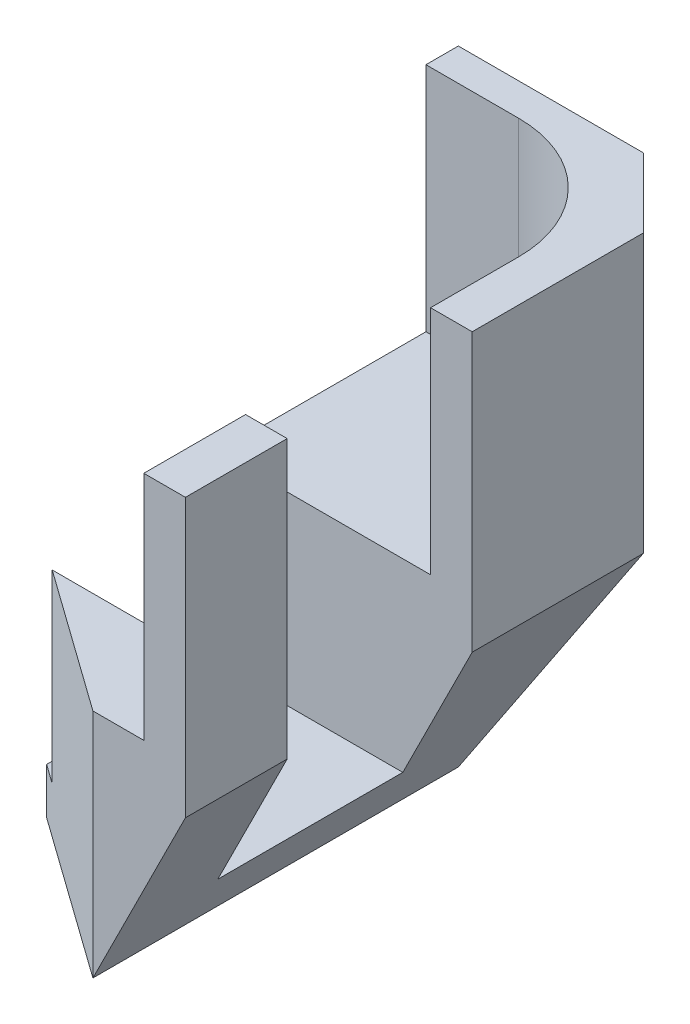
ISO-10303-21;
HEADER;
FILE_DESCRIPTION(('STEP AP214'),'2;1');
FILE_NAME('part.step','',(''),(''),'','','');
FILE_SCHEMA(('AUTOMOTIVE_DESIGN { 1 0 10303 214 1 1 1 1 }'));
ENDSEC;
DATA;
#1=APPLICATION_CONTEXT('core data for automotive mechanical design processes');
#2=APPLICATION_PROTOCOL_DEFINITION('international standard','automotive_design',2000,#1);
#3=PRODUCT_CONTEXT('',#1,'mechanical');
#4=PRODUCT('Part','Part','',(#3));
#5=PRODUCT_RELATED_PRODUCT_CATEGORY('part','',(#4));
#6=PRODUCT_DEFINITION_FORMATION('','',#4);
#7=PRODUCT_DEFINITION_CONTEXT('part definition',#1,'design');
#8=PRODUCT_DEFINITION('design','',#6,#7);
#9=PRODUCT_DEFINITION_SHAPE('','',#8);
#10=(LENGTH_UNIT() NAMED_UNIT(*) SI_UNIT(.MILLI.,.METRE.));
#11=(NAMED_UNIT(*) PLANE_ANGLE_UNIT() SI_UNIT($,.RADIAN.));
#12=(NAMED_UNIT(*) SI_UNIT($,.STERADIAN.) SOLID_ANGLE_UNIT());
#13=UNCERTAINTY_MEASURE_WITH_UNIT(LENGTH_MEASURE(1.E-05),#10,'distance_accuracy_value','');
#14=(GEOMETRIC_REPRESENTATION_CONTEXT(3) GLOBAL_UNCERTAINTY_ASSIGNED_CONTEXT((#13)) GLOBAL_UNIT_ASSIGNED_CONTEXT((#10,
#11,#12)) REPRESENTATION_CONTEXT('',''));
#15=CARTESIAN_POINT('',(0.,0.,0.));
#16=DIRECTION('',(0.,0.,1.));
#17=DIRECTION('',(1.,0.,0.));
#18=AXIS2_PLACEMENT_3D('',#15,#16,#17);
#19=CARTESIAN_POINT('',(0.,0.,0.));
#20=DIRECTION('',(0.,1.,0.));
#21=DIRECTION('',(0.,0.,1.));
#22=AXIS2_PLACEMENT_3D('',#19,#20,#21);
#23=PLANE('',#22);
#24=CARTESIAN_POINT('',(40.,0.,0.));
#25=DIRECTION('',(0.,-1.,0.));
#26=DIRECTION('',(0.,0.,1.));
#27=AXIS2_PLACEMENT_3D('',#24,#25,#26);
#28=CIRCLE('',#27,2.);
#29=CARTESIAN_POINT('',(40.,0.,2.));
#30=VERTEX_POINT('',#29);
#31=EDGE_CURVE('E238',#30,#30,#28,.T.);
#32=ORIENTED_EDGE('',*,*,#31,.F.);
#33=EDGE_LOOP('',(#32));
#34=FACE_BOUND('',#33,.T.);
#35=DIRECTION('',(0.,0.,1.));
#36=VECTOR('',#35,1.);
#37=CARTESIAN_POINT('',(20.,0.,0.));
#38=LINE('',#37,#36);
#39=CARTESIAN_POINT('',(20.,0.,-52.));
#40=VERTEX_POINT('',#39);
#41=CARTESIAN_POINT('',(20.,0.,17.));
#42=VERTEX_POINT('',#41);
#43=EDGE_CURVE('E176',#40,#42,#38,.T.);
#44=ORIENTED_EDGE('',*,*,#43,.F.);
#45=DIRECTION('',(1.,0.,0.));
#46=VECTOR('',#45,1.);
#47=CARTESIAN_POINT('',(-35.,0.,-52.));
#48=LINE('',#47,#46);
#49=CARTESIAN_POINT('',(40.0000700401635,0.,-52.));
#50=VERTEX_POINT('',#49);
#51=EDGE_CURVE('E51',#40,#50,#48,.T.);
#52=ORIENTED_EDGE('',*,*,#51,.T.);
#53=DIRECTION('',(0.707106781186547,0.,0.707106781186547));
#54=VECTOR('',#53,1.);
#55=CARTESIAN_POINT('',(55.,0.,-37.0000700401634));
#56=LINE('',#55,#54);
#57=CARTESIAN_POINT('',(55.,0.,-37.0000700401635));
#58=VERTEX_POINT('',#57);
#59=EDGE_CURVE('E11',#50,#58,#56,.T.);
#60=ORIENTED_EDGE('',*,*,#59,.T.);
#61=DIRECTION('',(0.,0.,-1.));
#62=VECTOR('',#61,1.);
#63=CARTESIAN_POINT('',(55.,0.,42.));
#64=LINE('',#63,#62);
#65=CARTESIAN_POINT('',(55.,0.,42.));
#66=VERTEX_POINT('',#65);
#67=EDGE_CURVE('E289',#66,#58,#64,.T.);
#68=ORIENTED_EDGE('',*,*,#67,.F.);
#69=DIRECTION('',(-0.813733471206735,0.,-0.581238193719096));
#70=VECTOR('',#69,1.);
#71=CARTESIAN_POINT('',(55.,0.,42.));
#72=LINE('',#71,#70);
#73=EDGE_CURVE('E241',#66,#42,#72,.T.);
#74=ORIENTED_EDGE('',*,*,#73,.T.);
#75=EDGE_LOOP('',(#44,#52,#60,#68,#74));
#76=FACE_BOUND('',#75,.T.);
#77=ADVANCED_FACE('F36',(#34,#76),#23,.F.);
#78=CARTESIAN_POINT('',(20.,50.,-72.));
#79=DIRECTION('',(0.,0.,1.));
#80=DIRECTION('',(1.,0.,0.));
#81=AXIS2_PLACEMENT_3D('',#78,#79,#80);
#82=PLANE('',#81);
#83=DIRECTION('',(0.,-1.,0.));
#84=VECTOR('',#83,1.);
#85=CARTESIAN_POINT('',(20.,50.,-72.));
#86=LINE('',#85,#84);
#87=CARTESIAN_POINT('',(20.,100.,-72.));
#88=VERTEX_POINT('',#87);
#89=CARTESIAN_POINT('',(20.,40.,-72.));
#90=VERTEX_POINT('',#89);
#91=EDGE_CURVE('E351',#88,#90,#86,.T.);
#92=ORIENTED_EDGE('',*,*,#91,.F.);
#93=DIRECTION('',(-1.,0.,0.));
#94=VECTOR('',#93,1.);
#95=CARTESIAN_POINT('',(-20.,100.,-72.));
#96=LINE('',#95,#94);
#97=CARTESIAN_POINT('',(60.,100.,-72.));
#98=VERTEX_POINT('',#97);
#99=EDGE_CURVE('E182',#98,#88,#96,.T.);
#100=ORIENTED_EDGE('',*,*,#99,.F.);
#101=DIRECTION('',(0.,-1.,0.));
#102=VECTOR('',#101,1.);
#103=CARTESIAN_POINT('',(60.,0.,-72.));
#104=LINE('',#103,#102);
#105=CARTESIAN_POINT('',(60.,40.,-72.));
#106=VERTEX_POINT('',#105);
#107=EDGE_CURVE('E181',#98,#106,#104,.T.);
#108=ORIENTED_EDGE('',*,*,#107,.T.);
#109=DIRECTION('',(1.,0.,0.));
#110=VECTOR('',#109,1.);
#111=CARTESIAN_POINT('',(-35.,40.,-72.));
#112=LINE('',#111,#110);
#113=EDGE_CURVE('E253',#90,#106,#112,.T.);
#114=ORIENTED_EDGE('',*,*,#113,.F.);
#115=EDGE_LOOP('',(#92,#100,#108,#114));
#116=FACE_BOUND('',#115,.T.);
#117=ADVANCED_FACE('F371',(#116),#82,.F.);
#118=CARTESIAN_POINT('',(0.,10.,0.));
#119=DIRECTION('',(0.,1.,0.));
#120=DIRECTION('',(0.,0.,1.));
#121=AXIS2_PLACEMENT_3D('',#118,#119,#120);
#122=PLANE('',#121);
#123=CARTESIAN_POINT('',(40.,10.,0.));
#124=DIRECTION('',(0.,1.,0.));
#125=DIRECTION('',(0.,0.,1.));
#126=AXIS2_PLACEMENT_3D('',#123,#124,#125);
#127=CIRCLE('',#126,2.);
#128=CARTESIAN_POINT('',(40.,10.,2.));
#129=VERTEX_POINT('',#128);
#130=EDGE_CURVE('E199',#129,#129,#127,.F.);
#131=ORIENTED_EDGE('',*,*,#130,.T.);
#132=EDGE_LOOP('',(#131));
#133=FACE_BOUND('',#132,.T.);
#134=DIRECTION('',(-1.,0.,0.));
#135=VECTOR('',#134,1.);
#136=CARTESIAN_POINT('',(-35.,10.,-20.));
#137=LINE('',#136,#135);
#138=CARTESIAN_POINT('',(60.,10.,-20.));
#139=VERTEX_POINT('',#138);
#140=CARTESIAN_POINT('',(20.,10.,-20.));
#141=VERTEX_POINT('',#140);
#142=EDGE_CURVE('E193',#139,#141,#137,.T.);
#143=ORIENTED_EDGE('',*,*,#142,.T.);
#144=DIRECTION('',(0.,0.,1.));
#145=VECTOR('',#144,1.);
#146=CARTESIAN_POINT('',(20.,10.,0.));
#147=LINE('',#146,#145);
#148=CARTESIAN_POINT('',(20.,10.,17.));
#149=VERTEX_POINT('',#148);
#150=EDGE_CURVE('E174',#141,#149,#147,.T.);
#151=ORIENTED_EDGE('',*,*,#150,.T.);
#152=DIRECTION('',(-0.813733471206735,0.,-0.581238193719096));
#153=VECTOR('',#152,1.);
#154=CARTESIAN_POINT('',(55.,10.,42.));
#155=LINE('',#154,#153);
#156=CARTESIAN_POINT('',(24.2,10.,20.));
#157=VERTEX_POINT('',#156);
#158=EDGE_CURVE('E189',#157,#149,#155,.T.);
#159=ORIENTED_EDGE('',*,*,#158,.F.);
#160=DIRECTION('',(-1.,0.,0.));
#161=VECTOR('',#160,1.);
#162=CARTESIAN_POINT('',(75.,10.,20.));
#163=LINE('',#162,#161);
#164=CARTESIAN_POINT('',(60.,9.99999999999998,20.));
#165=VERTEX_POINT('',#164);
#166=EDGE_CURVE('E308',#165,#157,#163,.T.);
#167=ORIENTED_EDGE('',*,*,#166,.F.);
#168=DIRECTION('',(0.,0.,-1.));
#169=VECTOR('',#168,1.);
#170=CARTESIAN_POINT('',(60.,10.,0.));
#171=LINE('',#170,#169);
#172=EDGE_CURVE('E301',#165,#139,#171,.T.);
#173=ORIENTED_EDGE('',*,*,#172,.T.);
#174=EDGE_LOOP('',(#143,#151,#159,#167,#173));
#175=FACE_BOUND('',#174,.T.);
#176=ADVANCED_FACE('F187',(#133,#175),#122,.T.);
#177=CARTESIAN_POINT('',(-35.,100.,-20.));
#178=DIRECTION('',(0.,0.,1.));
#179=DIRECTION('',(1.,0.,0.));
#180=AXIS2_PLACEMENT_3D('',#177,#178,#179);
#181=PLANE('',#180);
#182=DIRECTION('',(1.,0.,0.));
#183=VECTOR('',#182,1.);
#184=CARTESIAN_POINT('',(0.,50.,-20.));
#185=LINE('',#184,#183);
#186=CARTESIAN_POINT('',(20.,50.,-20.));
#187=VERTEX_POINT('',#186);
#188=CARTESIAN_POINT('',(66.,50.,-20.));
#189=VERTEX_POINT('',#188);
#190=EDGE_CURVE('E257',#187,#189,#185,.T.);
#191=ORIENTED_EDGE('',*,*,#190,.F.);
#192=DIRECTION('',(0.,-1.,0.));
#193=VECTOR('',#192,1.);
#194=CARTESIAN_POINT('',(20.,100.,-20.));
#195=LINE('',#194,#193);
#196=EDGE_CURVE('E349',#187,#141,#195,.T.);
#197=ORIENTED_EDGE('',*,*,#196,.T.);
#198=ORIENTED_EDGE('',*,*,#142,.F.);
#199=DIRECTION('',(0.447213595499958,0.894427190999916,0.));
#200=VECTOR('',#199,1.);
#201=CARTESIAN_POINT('',(77.,44.,-20.));
#202=LINE('',#201,#200);
#203=CARTESIAN_POINT('',(75.,40.,-20.));
#204=VERTEX_POINT('',#203);
#205=EDGE_CURVE('E303',#139,#204,#202,.T.);
#206=ORIENTED_EDGE('',*,*,#205,.T.);
#207=DIRECTION('',(0.,-1.,0.));
#208=VECTOR('',#207,1.);
#209=CARTESIAN_POINT('',(75.,100.,-20.));
#210=LINE('',#209,#208);
#211=CARTESIAN_POINT('',(75.,100.,-20.));
#212=VERTEX_POINT('',#211);
#213=EDGE_CURVE('E319',#212,#204,#210,.T.);
#214=ORIENTED_EDGE('',*,*,#213,.F.);
#215=DIRECTION('',(1.,0.,0.));
#216=VECTOR('',#215,1.);
#217=CARTESIAN_POINT('',(75.,100.,-20.));
#218=LINE('',#217,#216);
#219=CARTESIAN_POINT('',(66.,100.,-20.));
#220=VERTEX_POINT('',#219);
#221=EDGE_CURVE('E310',#220,#212,#218,.T.);
#222=ORIENTED_EDGE('',*,*,#221,.F.);
#223=DIRECTION('',(0.,-1.,0.));
#224=VECTOR('',#223,1.);
#225=CARTESIAN_POINT('',(66.,100.,-20.));
#226=LINE('',#225,#224);
#227=EDGE_CURVE('E271',#220,#189,#226,.T.);
#228=ORIENTED_EDGE('',*,*,#227,.T.);
#229=EDGE_LOOP('',(#191,#197,#198,#206,#214,#222,#228));
#230=FACE_BOUND('',#229,.T.);
#231=ADVANCED_FACE('F348',(#230),#181,.T.);
#232=CARTESIAN_POINT('',(0.,50.,0.));
#233=DIRECTION('',(0.,1.,0.));
#234=DIRECTION('',(0.,0.,1.));
#235=AXIS2_PLACEMENT_3D('',#232,#233,#234);
#236=PLANE('',#235);
#237=DIRECTION('',(1.,0.,0.));
#238=VECTOR('',#237,1.);
#239=CARTESIAN_POINT('',(20.,50.,-65.));
#240=LINE('',#239,#238);
#241=CARTESIAN_POINT('',(20.,50.,-65.));
#242=VERTEX_POINT('',#241);
#243=CARTESIAN_POINT('',(40.,50.,-65.));
#244=VERTEX_POINT('',#243);
#245=EDGE_CURVE('E259',#242,#244,#240,.T.);
#246=ORIENTED_EDGE('',*,*,#245,.F.);
#247=DIRECTION('',(0.,0.,1.));
#248=VECTOR('',#247,1.);
#249=CARTESIAN_POINT('',(20.,50.,0.));
#250=LINE('',#249,#248);
#251=EDGE_CURVE('E361',#242,#187,#250,.T.);
#252=ORIENTED_EDGE('',*,*,#251,.T.);
#253=ORIENTED_EDGE('',*,*,#190,.T.);
#254=DIRECTION('',(0.,0.,-1.));
#255=VECTOR('',#254,1.);
#256=CARTESIAN_POINT('',(66.,50.,-39.));
#257=LINE('',#256,#255);
#258=CARTESIAN_POINT('',(66.,50.,-39.));
#259=VERTEX_POINT('',#258);
#260=EDGE_CURVE('E202',#189,#259,#257,.T.);
#261=ORIENTED_EDGE('',*,*,#260,.T.);
#262=CARTESIAN_POINT('',(40.,50.,-39.));
#263=DIRECTION('',(0.,1.,0.));
#264=DIRECTION('',(0.,0.,1.));
#265=AXIS2_PLACEMENT_3D('',#262,#263,#264);
#266=CIRCLE('',#265,26.);
#267=EDGE_CURVE('E198',#259,#244,#266,.T.);
#268=ORIENTED_EDGE('',*,*,#267,.T.);
#269=EDGE_LOOP('',(#246,#252,#253,#261,#268));
#270=FACE_BOUND('',#269,.T.);
#271=ADVANCED_FACE('F392',(#270),#236,.T.);
#272=CARTESIAN_POINT('',(0.,100.,-39.));
#273=DIRECTION('',(0.,1.,0.));
#274=DIRECTION('',(0.,0.,1.));
#275=AXIS2_PLACEMENT_3D('',#272,#273,#274);
#276=PLANE('',#275);
#277=ORIENTED_EDGE('',*,*,#99,.T.);
#278=DIRECTION('',(0.,0.,1.));
#279=VECTOR('',#278,1.);
#280=CARTESIAN_POINT('',(20.,100.,-39.));
#281=LINE('',#280,#279);
#282=CARTESIAN_POINT('',(20.,100.,-65.));
#283=VERTEX_POINT('',#282);
#284=EDGE_CURVE('E354',#88,#283,#281,.T.);
#285=ORIENTED_EDGE('',*,*,#284,.T.);
#286=DIRECTION('',(1.,0.,0.));
#287=VECTOR('',#286,1.);
#288=CARTESIAN_POINT('',(20.,100.,-65.));
#289=LINE('',#288,#287);
#290=CARTESIAN_POINT('',(40.,100.,-65.));
#291=VERTEX_POINT('',#290);
#292=EDGE_CURVE('E260',#283,#291,#289,.T.);
#293=ORIENTED_EDGE('',*,*,#292,.T.);
#294=CARTESIAN_POINT('',(40.,100.,-39.));
#295=DIRECTION('',(0.,1.,0.));
#296=DIRECTION('',(0.,0.,1.));
#297=AXIS2_PLACEMENT_3D('',#294,#295,#296);
#298=CIRCLE('',#297,26.);
#299=CARTESIAN_POINT('',(66.,100.,-39.));
#300=VERTEX_POINT('',#299);
#301=EDGE_CURVE('E212',#300,#291,#298,.T.);
#302=ORIENTED_EDGE('',*,*,#301,.F.);
#303=DIRECTION('',(0.,0.,-1.));
#304=VECTOR('',#303,1.);
#305=CARTESIAN_POINT('',(66.,100.,-39.));
#306=LINE('',#305,#304);
#307=EDGE_CURVE('E216',#220,#300,#306,.T.);
#308=ORIENTED_EDGE('',*,*,#307,.F.);
#309=ORIENTED_EDGE('',*,*,#221,.T.);
#310=DIRECTION('',(0.,0.,1.));
#311=VECTOR('',#310,1.);
#312=CARTESIAN_POINT('',(75.,100.,42.));
#313=LINE('',#312,#311);
#314=CARTESIAN_POINT('',(75.,100.,-57.));
#315=VERTEX_POINT('',#314);
#316=EDGE_CURVE('E224',#315,#212,#313,.T.);
#317=ORIENTED_EDGE('',*,*,#316,.F.);
#318=DIRECTION('',(0.707106781186549,0.,0.707106781186546));
#319=VECTOR('',#318,1.);
#320=CARTESIAN_POINT('',(75.,100.,-57.));
#321=LINE('',#320,#319);
#322=EDGE_CURVE('E209',#98,#315,#321,.T.);
#323=ORIENTED_EDGE('',*,*,#322,.F.);
#324=EDGE_LOOP('',(#277,#285,#293,#302,#308,#309,#317,#323));
#325=FACE_BOUND('',#324,.T.);
#326=ADVANCED_FACE('F373',(#325),#276,.T.);
#327=CARTESIAN_POINT('',(20.,100.,-65.));
#328=DIRECTION('',(0.,0.,-1.));
#329=DIRECTION('',(-1.,0.,0.));
#330=AXIS2_PLACEMENT_3D('',#327,#328,#329);
#331=PLANE('',#330);
#332=DIRECTION('',(0.,1.,0.));
#333=VECTOR('',#332,1.);
#334=CARTESIAN_POINT('',(20.,100.,-65.));
#335=LINE('',#334,#333);
#336=EDGE_CURVE('E363',#242,#283,#335,.T.);
#337=ORIENTED_EDGE('',*,*,#336,.F.);
#338=ORIENTED_EDGE('',*,*,#245,.T.);
#339=DIRECTION('',(0.,-1.,0.));
#340=VECTOR('',#339,1.);
#341=CARTESIAN_POINT('',(40.,100.,-65.));
#342=LINE('',#341,#340);
#343=EDGE_CURVE('E235',#291,#244,#342,.T.);
#344=ORIENTED_EDGE('',*,*,#343,.F.);
#345=ORIENTED_EDGE('',*,*,#292,.F.);
#346=EDGE_LOOP('',(#337,#338,#344,#345));
#347=FACE_BOUND('',#346,.T.);
#348=ADVANCED_FACE('F395',(#347),#331,.F.);
#349=CARTESIAN_POINT('',(-35.,40.,-72.));
#350=DIRECTION('',(0.,0.447213595499958,0.894427190999916));
#351=DIRECTION('',(0.,-0.894427190999916,0.447213595499958));
#352=AXIS2_PLACEMENT_3D('',#349,#350,#351);
#353=PLANE('',#352);
#354=DIRECTION('',(0.,-0.894427190999916,0.447213595499958));
#355=VECTOR('',#354,1.);
#356=CARTESIAN_POINT('',(20.,40.,-72.));
#357=LINE('',#356,#355);
#358=EDGE_CURVE('E352',#90,#40,#357,.T.);
#359=ORIENTED_EDGE('',*,*,#358,.F.);
#360=ORIENTED_EDGE('',*,*,#113,.T.);
#361=DIRECTION('',(-0.408248290463864,0.816496580927725,-0.408248290463863));
#362=VECTOR('',#361,1.);
#363=CARTESIAN_POINT('',(56.6666666666667,46.6666666666667,-75.3333333333333));
#364=LINE('',#363,#362);
#365=CARTESIAN_POINT('',(60.0000350200817,39.9999299598365,-71.9999649799183));
#366=VERTEX_POINT('',#365);
#367=EDGE_CURVE('E284',#366,#106,#364,.T.);
#368=ORIENTED_EDGE('',*,*,#367,.F.);
#369=DIRECTION('',(-0.408248290463863,-0.816496580927726,0.408248290463863));
#370=VECTOR('',#369,1.);
#371=CARTESIAN_POINT('',(42.5000583668029,4.99997665327885,-54.4999883266394));
#372=LINE('',#371,#370);
#373=EDGE_CURVE('E45',#366,#50,#372,.T.);
#374=ORIENTED_EDGE('',*,*,#373,.T.);
#375=ORIENTED_EDGE('',*,*,#51,.F.);
#376=EDGE_LOOP('',(#359,#360,#368,#374,#375));
#377=FACE_BOUND('',#376,.T.);
#378=ADVANCED_FACE('F283',(#377),#353,.F.);
#379=CARTESIAN_POINT('',(60.,50.,-72.));
#380=DIRECTION('',(0.707106781186546,0.,-0.707106781186549));
#381=DIRECTION('',(0.,1.,0.));
#382=AXIS2_PLACEMENT_3D('',#379,#380,#381);
#383=PLANE('',#382);
#384=DIRECTION('',(-0.408248290463863,-0.816496580927726,-0.408248290463862));
#385=VECTOR('',#384,1.);
#386=CARTESIAN_POINT('',(73.3333333333334,36.6666666666667,-58.6666666666667));
#387=LINE('',#386,#385);
#388=CARTESIAN_POINT('',(75.,40.,-57.));
#389=VERTEX_POINT('',#388);
#390=CARTESIAN_POINT('',(74.9999649799183,39.9999299598366,-57.0000350200817));
#391=VERTEX_POINT('',#390);
#392=EDGE_CURVE('E306',#389,#391,#387,.T.);
#393=ORIENTED_EDGE('',*,*,#392,.T.);
#394=DIRECTION('',(-0.707106781186549,0.,-0.707106781186546));
#395=VECTOR('',#394,1.);
#396=CARTESIAN_POINT('',(60.,39.9999299598365,-72.));
#397=LINE('',#396,#395);
#398=EDGE_CURVE('E59',#391,#366,#397,.T.);
#399=ORIENTED_EDGE('',*,*,#398,.T.);
#400=ORIENTED_EDGE('',*,*,#367,.T.);
#401=ORIENTED_EDGE('',*,*,#107,.F.);
#402=ORIENTED_EDGE('',*,*,#322,.T.);
#403=DIRECTION('',(0.,1.,0.));
#404=VECTOR('',#403,1.);
#405=CARTESIAN_POINT('',(75.,50.,-57.));
#406=LINE('',#405,#404);
#407=EDGE_CURVE('E267',#389,#315,#406,.T.);
#408=ORIENTED_EDGE('',*,*,#407,.F.);
#409=EDGE_LOOP('',(#393,#399,#400,#401,#402,#408));
#410=FACE_BOUND('',#409,.T.);
#411=ADVANCED_FACE('F366',(#410),#383,.T.);
#412=CARTESIAN_POINT('',(55.,0.,42.));
#413=DIRECTION('',(0.894427190999916,-0.447213595499958,0.));
#414=DIRECTION('',(0.447213595499958,0.894427190999916,0.));
#415=AXIS2_PLACEMENT_3D('',#412,#413,#414);
#416=PLANE('',#415);
#417=ORIENTED_EDGE('',*,*,#67,.T.);
#418=DIRECTION('',(0.408248290463863,0.816496580927726,-0.408248290463863));
#419=VECTOR('',#418,1.);
#420=CARTESIAN_POINT('',(69.9999883266394,29.9999766532789,-52.0000583668029));
#421=LINE('',#420,#419);
#422=EDGE_CURVE('E276',#58,#391,#421,.T.);
#423=ORIENTED_EDGE('',*,*,#422,.T.);
#424=ORIENTED_EDGE('',*,*,#392,.F.);
#425=DIRECTION('',(0.,0.,-1.));
#426=VECTOR('',#425,1.);
#427=CARTESIAN_POINT('',(75.,40.,42.));
#428=LINE('',#427,#426);
#429=EDGE_CURVE('E294',#204,#389,#428,.T.);
#430=ORIENTED_EDGE('',*,*,#429,.F.);
#431=ORIENTED_EDGE('',*,*,#205,.F.);
#432=ORIENTED_EDGE('',*,*,#172,.F.);
#433=DIRECTION('',(0.447213595499958,0.894427190999916,0.));
#434=VECTOR('',#433,1.);
#435=CARTESIAN_POINT('',(99.,88.,20.));
#436=LINE('',#435,#434);
#437=CARTESIAN_POINT('',(75.,40.,20.));
#438=VERTEX_POINT('',#437);
#439=EDGE_CURVE('E273',#165,#438,#436,.T.);
#440=ORIENTED_EDGE('',*,*,#439,.T.);
#441=CARTESIAN_POINT('',(75.,40.,42.));
#442=VERTEX_POINT('',#441);
#443=EDGE_CURVE('E297',#442,#438,#428,.T.);
#444=ORIENTED_EDGE('',*,*,#443,.F.);
#445=DIRECTION('',(-0.447213595499958,-0.894427190999916,0.));
#446=VECTOR('',#445,1.);
#447=CARTESIAN_POINT('',(55.,0.,42.));
#448=LINE('',#447,#446);
#449=EDGE_CURVE('E293',#442,#66,#448,.T.);
#450=ORIENTED_EDGE('',*,*,#449,.T.);
#451=EDGE_LOOP('',(#417,#423,#424,#430,#431,#432,#440,#444,#450));
#452=FACE_BOUND('',#451,.T.);
#453=ADVANCED_FACE('F291',(#452),#416,.T.);
#454=CARTESIAN_POINT('',(75.,50.,42.));
#455=DIRECTION('',(0.,0.,1.));
#456=DIRECTION('',(1.,0.,0.));
#457=AXIS2_PLACEMENT_3D('',#454,#455,#456);
#458=PLANE('',#457);
#459=DIRECTION('',(0.,-1.,0.));
#460=VECTOR('',#459,1.);
#461=CARTESIAN_POINT('',(55.,50.,42.));
#462=LINE('',#461,#460);
#463=CARTESIAN_POINT('',(55.,50.,42.));
#464=VERTEX_POINT('',#463);
#465=EDGE_CURVE('E250',#464,#66,#462,.T.);
#466=ORIENTED_EDGE('',*,*,#465,.T.);
#467=ORIENTED_EDGE('',*,*,#449,.F.);
#468=DIRECTION('',(0.,-1.,0.));
#469=VECTOR('',#468,1.);
#470=CARTESIAN_POINT('',(75.,50.,42.));
#471=LINE('',#470,#469);
#472=CARTESIAN_POINT('',(75.,100.,42.));
#473=VERTEX_POINT('',#472);
#474=EDGE_CURVE('E246',#473,#442,#471,.T.);
#475=ORIENTED_EDGE('',*,*,#474,.F.);
#476=DIRECTION('',(-1.,0.,0.));
#477=VECTOR('',#476,1.);
#478=CARTESIAN_POINT('',(66.,100.,42.));
#479=LINE('',#478,#477);
#480=CARTESIAN_POINT('',(66.,100.,42.));
#481=VERTEX_POINT('',#480);
#482=EDGE_CURVE('E220',#473,#481,#479,.T.);
#483=ORIENTED_EDGE('',*,*,#482,.T.);
#484=DIRECTION('',(0.,-1.,0.));
#485=VECTOR('',#484,1.);
#486=CARTESIAN_POINT('',(66.,100.,42.));
#487=LINE('',#486,#485);
#488=CARTESIAN_POINT('',(66.,50.,42.));
#489=VERTEX_POINT('',#488);
#490=EDGE_CURVE('E226',#481,#489,#487,.T.);
#491=ORIENTED_EDGE('',*,*,#490,.T.);
#492=DIRECTION('',(-1.,0.,0.));
#493=VECTOR('',#492,1.);
#494=CARTESIAN_POINT('',(75.,50.,42.));
#495=LINE('',#494,#493);
#496=EDGE_CURVE('E244',#489,#464,#495,.T.);
#497=ORIENTED_EDGE('',*,*,#496,.T.);
#498=EDGE_LOOP('',(#466,#467,#475,#483,#491,#497));
#499=FACE_BOUND('',#498,.T.);
#500=ADVANCED_FACE('F333',(#499),#458,.T.);
#501=CARTESIAN_POINT('',(75.,50.,-72.));
#502=DIRECTION('',(1.,0.,0.));
#503=DIRECTION('',(0.,0.,-1.));
#504=AXIS2_PLACEMENT_3D('',#501,#502,#503);
#505=PLANE('',#504);
#506=ORIENTED_EDGE('',*,*,#474,.T.);
#507=ORIENTED_EDGE('',*,*,#443,.T.);
#508=DIRECTION('',(0.,-1.,0.));
#509=VECTOR('',#508,1.);
#510=CARTESIAN_POINT('',(75.,100.,20.));
#511=LINE('',#510,#509);
#512=CARTESIAN_POINT('',(75.,100.,20.));
#513=VERTEX_POINT('',#512);
#514=EDGE_CURVE('E316',#513,#438,#511,.T.);
#515=ORIENTED_EDGE('',*,*,#514,.F.);
#516=EDGE_CURVE('E223',#513,#473,#313,.T.);
#517=ORIENTED_EDGE('',*,*,#516,.T.);
#518=EDGE_LOOP('',(#506,#507,#515,#517));
#519=FACE_BOUND('',#518,.T.);
#520=ADVANCED_FACE('F344',(#519),#505,.T.);
#521=ORIENTED_EDGE('',*,*,#213,.T.);
#522=ORIENTED_EDGE('',*,*,#429,.T.);
#523=ORIENTED_EDGE('',*,*,#407,.T.);
#524=ORIENTED_EDGE('',*,*,#316,.T.);
#525=EDGE_LOOP('',(#521,#522,#523,#524));
#526=FACE_BOUND('',#525,.T.);
#527=ADVANCED_FACE('F378',(#526),#505,.T.);
#528=CARTESIAN_POINT('',(75.,100.,20.));
#529=DIRECTION('',(0.,0.,1.));
#530=DIRECTION('',(1.,0.,0.));
#531=AXIS2_PLACEMENT_3D('',#528,#529,#530);
#532=PLANE('',#531);
#533=ORIENTED_EDGE('',*,*,#439,.F.);
#534=ORIENTED_EDGE('',*,*,#166,.T.);
#535=DIRECTION('',(0.,1.,0.));
#536=VECTOR('',#535,1.);
#537=CARTESIAN_POINT('',(24.2,50.,20.));
#538=LINE('',#537,#536);
#539=CARTESIAN_POINT('',(24.2,50.,20.));
#540=VERTEX_POINT('',#539);
#541=EDGE_CURVE('E197',#157,#540,#538,.T.);
#542=ORIENTED_EDGE('',*,*,#541,.T.);
#543=DIRECTION('',(1.,0.,0.));
#544=VECTOR('',#543,1.);
#545=CARTESIAN_POINT('',(0.,50.,20.));
#546=LINE('',#545,#544);
#547=CARTESIAN_POINT('',(66.,50.,20.));
#548=VERTEX_POINT('',#547);
#549=EDGE_CURVE('E321',#540,#548,#546,.T.);
#550=ORIENTED_EDGE('',*,*,#549,.T.);
#551=DIRECTION('',(0.,1.,0.));
#552=VECTOR('',#551,1.);
#553=CARTESIAN_POINT('',(66.,100.,20.));
#554=LINE('',#553,#552);
#555=CARTESIAN_POINT('',(66.,100.,20.));
#556=VERTEX_POINT('',#555);
#557=EDGE_CURVE('E269',#548,#556,#554,.T.);
#558=ORIENTED_EDGE('',*,*,#557,.T.);
#559=DIRECTION('',(-1.,0.,0.));
#560=VECTOR('',#559,1.);
#561=CARTESIAN_POINT('',(75.,100.,20.));
#562=LINE('',#561,#560);
#563=EDGE_CURVE('E313',#513,#556,#562,.T.);
#564=ORIENTED_EDGE('',*,*,#563,.F.);
#565=ORIENTED_EDGE('',*,*,#514,.T.);
#566=EDGE_LOOP('',(#533,#534,#542,#550,#558,#564,#565));
#567=FACE_BOUND('',#566,.T.);
#568=ADVANCED_FACE('F326',(#567),#532,.F.);
#569=CARTESIAN_POINT('',(40.,50.,0.));
#570=DIRECTION('',(0.,-1.,0.));
#571=DIRECTION('',(0.,0.,-1.));
#572=AXIS2_PLACEMENT_3D('',#569,#570,#571);
#573=CYLINDRICAL_SURFACE('',#572,2.);
#574=ORIENTED_EDGE('',*,*,#31,.T.);
#575=EDGE_LOOP('',(#574));
#576=FACE_BOUND('',#575,.T.);
#577=ORIENTED_EDGE('',*,*,#130,.F.);
#578=EDGE_LOOP('',(#577));
#579=FACE_BOUND('',#578,.T.);
#580=ADVANCED_FACE('F429',(#576,#579),#573,.F.);
#581=CARTESIAN_POINT('',(66.,100.,-39.));
#582=DIRECTION('',(-1.,0.,0.));
#583=DIRECTION('',(0.,0.,1.));
#584=AXIS2_PLACEMENT_3D('',#581,#582,#583);
#585=PLANE('',#584);
#586=ORIENTED_EDGE('',*,*,#227,.F.);
#587=ORIENTED_EDGE('',*,*,#307,.T.);
#588=DIRECTION('',(0.,-1.,0.));
#589=VECTOR('',#588,1.);
#590=CARTESIAN_POINT('',(66.,100.,-39.));
#591=LINE('',#590,#589);
#592=EDGE_CURVE('E232',#300,#259,#591,.T.);
#593=ORIENTED_EDGE('',*,*,#592,.T.);
#594=ORIENTED_EDGE('',*,*,#260,.F.);
#595=EDGE_LOOP('',(#586,#587,#593,#594));
#596=FACE_BOUND('',#595,.T.);
#597=ADVANCED_FACE('F384',(#596),#585,.T.);
#598=ORIENTED_EDGE('',*,*,#549,.F.);
#599=DIRECTION('',(-0.813733471206735,0.,-0.581238193719096));
#600=VECTOR('',#599,1.);
#601=CARTESIAN_POINT('',(55.,50.,42.));
#602=LINE('',#601,#600);
#603=EDGE_CURVE('E242',#464,#540,#602,.T.);
#604=ORIENTED_EDGE('',*,*,#603,.F.);
#605=ORIENTED_EDGE('',*,*,#496,.F.);
#606=EDGE_CURVE('E213',#489,#548,#257,.T.);
#607=ORIENTED_EDGE('',*,*,#606,.T.);
#608=EDGE_LOOP('',(#598,#604,#605,#607));
#609=FACE_BOUND('',#608,.T.);
#610=ADVANCED_FACE('F329',(#609),#236,.T.);
#611=ORIENTED_EDGE('',*,*,#563,.T.);
#612=EDGE_CURVE('E217',#481,#556,#306,.T.);
#613=ORIENTED_EDGE('',*,*,#612,.F.);
#614=ORIENTED_EDGE('',*,*,#482,.F.);
#615=ORIENTED_EDGE('',*,*,#516,.F.);
#616=EDGE_LOOP('',(#611,#613,#614,#615));
#617=FACE_BOUND('',#616,.T.);
#618=ADVANCED_FACE('F342',(#617),#276,.T.);
#619=CARTESIAN_POINT('',(55.,50.,42.));
#620=DIRECTION('',(-0.581238193719096,0.,0.813733471206735));
#621=DIRECTION('',(0.813733471206735,0.,0.581238193719096));
#622=AXIS2_PLACEMENT_3D('',#619,#620,#621);
#623=PLANE('',#622);
#624=ORIENTED_EDGE('',*,*,#541,.F.);
#625=ORIENTED_EDGE('',*,*,#158,.T.);
#626=DIRECTION('',(0.,-1.,0.));
#627=VECTOR('',#626,1.);
#628=CARTESIAN_POINT('',(20.,50.,17.));
#629=LINE('',#628,#627);
#630=EDGE_CURVE('E171',#149,#42,#629,.T.);
#631=ORIENTED_EDGE('',*,*,#630,.T.);
#632=ORIENTED_EDGE('',*,*,#73,.F.);
#633=ORIENTED_EDGE('',*,*,#465,.F.);
#634=ORIENTED_EDGE('',*,*,#603,.T.);
#635=EDGE_LOOP('',(#624,#625,#631,#632,#633,#634));
#636=FACE_BOUND('',#635,.T.);
#637=ADVANCED_FACE('F195',(#636),#623,.T.);
#638=CARTESIAN_POINT('',(40.,100.,-39.));
#639=DIRECTION('',(0.,-1.,0.));
#640=DIRECTION('',(0.,0.,-1.));
#641=AXIS2_PLACEMENT_3D('',#638,#639,#640);
#642=CYLINDRICAL_SURFACE('',#641,26.);
#643=ORIENTED_EDGE('',*,*,#267,.F.);
#644=ORIENTED_EDGE('',*,*,#592,.F.);
#645=ORIENTED_EDGE('',*,*,#301,.T.);
#646=ORIENTED_EDGE('',*,*,#343,.T.);
#647=EDGE_LOOP('',(#643,#644,#645,#646));
#648=FACE_BOUND('',#647,.T.);
#649=ADVANCED_FACE('F388',(#648),#642,.F.);
#650=ORIENTED_EDGE('',*,*,#557,.F.);
#651=ORIENTED_EDGE('',*,*,#606,.F.);
#652=ORIENTED_EDGE('',*,*,#490,.F.);
#653=ORIENTED_EDGE('',*,*,#612,.T.);
#654=EDGE_LOOP('',(#650,#651,#652,#653));
#655=FACE_BOUND('',#654,.T.);
#656=ADVANCED_FACE('F338',(#655),#585,.T.);
#657=CARTESIAN_POINT('',(41.8333216599728,-26.3333566800545,-23.8333917001362));
#658=DIRECTION('',(0.577350269189626,-0.577350269189626,-0.577350269189626));
#659=DIRECTION('',(-0.408248290463863,-0.816496580927726,0.408248290463863));
#660=AXIS2_PLACEMENT_3D('',#657,#658,#659);
#661=PLANE('',#660);
#662=ORIENTED_EDGE('',*,*,#59,.F.);
#663=ORIENTED_EDGE('',*,*,#373,.F.);
#664=ORIENTED_EDGE('',*,*,#398,.F.);
#665=ORIENTED_EDGE('',*,*,#422,.F.);
#666=EDGE_LOOP('',(#662,#663,#664,#665));
#667=FACE_BOUND('',#666,.T.);
#668=ADVANCED_FACE('F39',(#667),#661,.T.);
#669=CARTESIAN_POINT('',(20.,0.,0.));
#670=DIRECTION('',(-1.,0.,0.));
#671=DIRECTION('',(0.,0.,1.));
#672=AXIS2_PLACEMENT_3D('',#669,#670,#671);
#673=PLANE('',#672);
#674=ORIENTED_EDGE('',*,*,#336,.T.);
#675=ORIENTED_EDGE('',*,*,#284,.F.);
#676=ORIENTED_EDGE('',*,*,#91,.T.);
#677=ORIENTED_EDGE('',*,*,#358,.T.);
#678=ORIENTED_EDGE('',*,*,#43,.T.);
#679=ORIENTED_EDGE('',*,*,#630,.F.);
#680=ORIENTED_EDGE('',*,*,#150,.F.);
#681=ORIENTED_EDGE('',*,*,#196,.F.);
#682=ORIENTED_EDGE('',*,*,#251,.F.);
#683=EDGE_LOOP('',(#674,#675,#676,#677,#678,#679,#680,#681,#682));
#684=FACE_BOUND('',#683,.T.);
#685=ADVANCED_FACE('F173',(#684),#673,.T.);
#686=CLOSED_SHELL('',(#77,#117,#176,#231,#271,#326,#348,#378,#411,#453,#500,#520,#527,#568,#580,
#597,#610,#618,#637,#649,#656,#668,#685));
#687=MANIFOLD_SOLID_BREP('B2',#686);
#688=ADVANCED_BREP_SHAPE_REPRESENTATION('',(#18,#687),#14);
#689=SHAPE_DEFINITION_REPRESENTATION(#9,#688);
ENDSEC;
END-ISO-10303-21;
